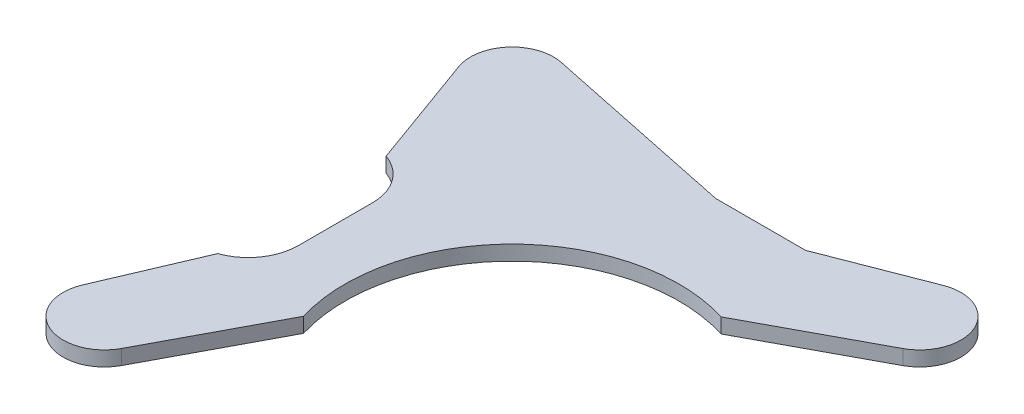
ISO-10303-21;
HEADER;
FILE_DESCRIPTION(('STEP AP214'),'2;1');
FILE_NAME('part.step','',(''),(''),'','','');
FILE_SCHEMA(('AUTOMOTIVE_DESIGN { 1 0 10303 214 1 1 1 1 }'));
ENDSEC;
DATA;
#1=APPLICATION_CONTEXT('core data for automotive mechanical design processes');
#2=APPLICATION_PROTOCOL_DEFINITION('international standard','automotive_design',2000,#1);
#3=PRODUCT_CONTEXT('',#1,'mechanical');
#4=PRODUCT('Part','Part','',(#3));
#5=PRODUCT_RELATED_PRODUCT_CATEGORY('part','',(#4));
#6=PRODUCT_DEFINITION_FORMATION('','',#4);
#7=PRODUCT_DEFINITION_CONTEXT('part definition',#1,'design');
#8=PRODUCT_DEFINITION('design','',#6,#7);
#9=PRODUCT_DEFINITION_SHAPE('','',#8);
#10=(LENGTH_UNIT() NAMED_UNIT(*) SI_UNIT(.MILLI.,.METRE.));
#11=(NAMED_UNIT(*) PLANE_ANGLE_UNIT() SI_UNIT($,.RADIAN.));
#12=(NAMED_UNIT(*) SI_UNIT($,.STERADIAN.) SOLID_ANGLE_UNIT());
#13=UNCERTAINTY_MEASURE_WITH_UNIT(LENGTH_MEASURE(1.E-05),#10,'distance_accuracy_value','');
#14=(GEOMETRIC_REPRESENTATION_CONTEXT(3) GLOBAL_UNCERTAINTY_ASSIGNED_CONTEXT((#13)) GLOBAL_UNIT_ASSIGNED_CONTEXT((#10,
#11,#12)) REPRESENTATION_CONTEXT('',''));
#15=CARTESIAN_POINT('',(0.,0.,0.));
#16=DIRECTION('',(0.,0.,1.));
#17=DIRECTION('',(1.,0.,0.));
#18=AXIS2_PLACEMENT_3D('',#15,#16,#17);
#19=CARTESIAN_POINT('',(-113.562518198404,153.3525,-81.0665633924503));
#20=DIRECTION('',(0.,-1.,0.));
#21=DIRECTION('',(0.,0.,-1.));
#22=AXIS2_PLACEMENT_3D('',#19,#20,#21);
#23=CYLINDRICAL_SURFACE('',#22,8.5725);
#24=CARTESIAN_POINT('',(-113.562518198404,150.8125,-81.0665633924503));
#25=DIRECTION('',(0.,1.,0.));
#26=DIRECTION('',(0.,0.,1.));
#27=AXIS2_PLACEMENT_3D('',#24,#25,#26);
#28=CIRCLE('',#27,8.5725);
#29=CARTESIAN_POINT('',(-104.990018198404,150.8125,-81.0665633924503));
#30=VERTEX_POINT('',#29);
#31=CARTESIAN_POINT('',(-110.73974168524,150.8125,-89.160986720071));
#32=VERTEX_POINT('',#31);
#33=EDGE_CURVE('E170',#30,#32,#28,.T.);
#34=ORIENTED_EDGE('',*,*,#33,.F.);
#35=DIRECTION('',(0.,-1.,0.));
#36=VECTOR('',#35,1.);
#37=CARTESIAN_POINT('',(-104.990018198404,153.3525,-81.0665633924503));
#38=LINE('',#37,#36);
#39=CARTESIAN_POINT('',(-104.990018198404,153.3525,-81.0665633924503));
#40=VERTEX_POINT('',#39);
#41=EDGE_CURVE('E11',#40,#30,#38,.T.);
#42=ORIENTED_EDGE('',*,*,#41,.F.);
#43=CARTESIAN_POINT('',(-113.562518198404,153.3525,-81.0665633924503));
#44=DIRECTION('',(0.,1.,0.));
#45=DIRECTION('',(0.,0.,1.));
#46=AXIS2_PLACEMENT_3D('',#43,#44,#45);
#47=CIRCLE('',#46,8.5725);
#48=CARTESIAN_POINT('',(-110.73974168524,153.3525,-89.160986720071));
#49=VERTEX_POINT('',#48);
#50=EDGE_CURVE('E205',#40,#49,#47,.T.);
#51=ORIENTED_EDGE('',*,*,#50,.T.);
#52=DIRECTION('',(0.,-1.,0.));
#53=VECTOR('',#52,1.);
#54=CARTESIAN_POINT('',(-110.73974168524,153.3525,-89.160986720071));
#55=LINE('',#54,#53);
#56=EDGE_CURVE('E55',#49,#32,#55,.T.);
#57=ORIENTED_EDGE('',*,*,#56,.T.);
#58=EDGE_LOOP('',(#34,#42,#51,#57));
#59=FACE_BOUND('',#58,.T.);
#60=ADVANCED_FACE('F39',(#59),#23,.F.);
#61=CARTESIAN_POINT('',(-104.990018198404,153.3525,4.58906832912148E-13));
#62=DIRECTION('',(1.,0.,0.));
#63=DIRECTION('',(0.,0.,-1.));
#64=AXIS2_PLACEMENT_3D('',#61,#62,#63);
#65=PLANE('',#64);
#66=DIRECTION('',(0.,0.,1.));
#67=VECTOR('',#66,1.);
#68=CARTESIAN_POINT('',(-104.990018198404,150.8125,4.58906832912148E-13));
#69=LINE('',#68,#67);
#70=CARTESIAN_POINT('',(-104.990018198404,150.8125,-68.3665633924507));
#71=VERTEX_POINT('',#70);
#72=EDGE_CURVE('E172',#30,#71,#69,.T.);
#73=ORIENTED_EDGE('',*,*,#72,.T.);
#74=DIRECTION('',(0.,-1.,0.));
#75=VECTOR('',#74,1.);
#76=CARTESIAN_POINT('',(-104.990018198404,153.3525,-68.3665633924507));
#77=LINE('',#76,#75);
#78=CARTESIAN_POINT('',(-104.990018198404,153.3525,-68.3665633924507));
#79=VERTEX_POINT('',#78);
#80=EDGE_CURVE('E47',#79,#71,#77,.T.);
#81=ORIENTED_EDGE('',*,*,#80,.F.);
#82=DIRECTION('',(0.,0.,1.));
#83=VECTOR('',#82,1.);
#84=CARTESIAN_POINT('',(-104.990018198404,153.3525,4.58906832912148E-13));
#85=LINE('',#84,#83);
#86=EDGE_CURVE('E418',#40,#79,#85,.T.);
#87=ORIENTED_EDGE('',*,*,#86,.F.);
#88=ORIENTED_EDGE('',*,*,#41,.T.);
#89=EDGE_LOOP('',(#73,#81,#87,#88));
#90=FACE_BOUND('',#89,.T.);
#91=ADVANCED_FACE('F235',(#90),#65,.F.);
#92=CARTESIAN_POINT('',(-113.562518198404,153.3525,-68.3665633924507));
#93=DIRECTION('',(0.,-1.,0.));
#94=DIRECTION('',(0.,0.,-1.));
#95=AXIS2_PLACEMENT_3D('',#92,#93,#94);
#96=CYLINDRICAL_SURFACE('',#95,8.57250000000006);
#97=CARTESIAN_POINT('',(-113.562518198404,150.8125,-68.3665633924507));
#98=DIRECTION('',(0.,1.,0.));
#99=DIRECTION('',(0.,0.,1.));
#100=AXIS2_PLACEMENT_3D('',#97,#98,#99);
#101=CIRCLE('',#100,8.57250000000006);
#102=CARTESIAN_POINT('',(-110.711477128956,150.8125,-60.2820522093105));
#103=VERTEX_POINT('',#102);
#104=EDGE_CURVE('E175',#103,#71,#101,.T.);
#105=ORIENTED_EDGE('',*,*,#104,.F.);
#106=DIRECTION('',(0.,-1.,0.));
#107=VECTOR('',#106,1.);
#108=CARTESIAN_POINT('',(-110.711477128956,153.3525,-60.2820522093105));
#109=LINE('',#108,#107);
#110=CARTESIAN_POINT('',(-110.711477128956,153.3525,-60.2820522093105));
#111=VERTEX_POINT('',#110);
#112=EDGE_CURVE('E225',#111,#103,#109,.T.);
#113=ORIENTED_EDGE('',*,*,#112,.F.);
#114=CARTESIAN_POINT('',(-113.562518198404,153.3525,-68.3665633924507));
#115=DIRECTION('',(0.,1.,0.));
#116=DIRECTION('',(0.,0.,1.));
#117=AXIS2_PLACEMENT_3D('',#114,#115,#116);
#118=CIRCLE('',#117,8.57250000000006);
#119=EDGE_CURVE('E232',#111,#79,#118,.T.);
#120=ORIENTED_EDGE('',*,*,#119,.T.);
#121=ORIENTED_EDGE('',*,*,#80,.T.);
#122=EDGE_LOOP('',(#105,#113,#120,#121));
#123=FACE_BOUND('',#122,.T.);
#124=ADVANCED_FACE('F230',(#123),#96,.F.);
#125=CARTESIAN_POINT('',(-115.433025578802,153.3525,-49.2056223935562));
#126=DIRECTION('',(0.919909867015772,0.,0.392129872066671));
#127=DIRECTION('',(0.392129872066671,0.,-0.919909867015772));
#128=AXIS2_PLACEMENT_3D('',#125,#126,#127);
#129=PLANE('',#128);
#130=DIRECTION('',(-0.392129872066671,0.,0.919909867015772));
#131=VECTOR('',#130,1.);
#132=CARTESIAN_POINT('',(-115.433025578802,150.8125,-49.2056223935562));
#133=LINE('',#132,#131);
#134=CARTESIAN_POINT('',(-117.631365352139,150.8125,-44.0484676022443));
#135=VERTEX_POINT('',#134);
#136=EDGE_CURVE('E178',#103,#135,#133,.T.);
#137=ORIENTED_EDGE('',*,*,#136,.T.);
#138=DIRECTION('',(0.,-1.,0.));
#139=VECTOR('',#138,1.);
#140=CARTESIAN_POINT('',(-117.631365352139,153.3525,-44.0484676022443));
#141=LINE('',#140,#139);
#142=CARTESIAN_POINT('',(-117.631365352139,153.3525,-44.0484676022443));
#143=VERTEX_POINT('',#142);
#144=EDGE_CURVE('E222',#143,#135,#141,.T.);
#145=ORIENTED_EDGE('',*,*,#144,.F.);
#146=DIRECTION('',(-0.392129872066671,0.,0.919909867015772));
#147=VECTOR('',#146,1.);
#148=CARTESIAN_POINT('',(-115.433025578802,153.3525,-49.2056223935562));
#149=LINE('',#148,#147);
#150=EDGE_CURVE('E252',#111,#143,#149,.T.);
#151=ORIENTED_EDGE('',*,*,#150,.F.);
#152=ORIENTED_EDGE('',*,*,#112,.T.);
#153=EDGE_LOOP('',(#137,#145,#151,#152));
#154=FACE_BOUND('',#153,.T.);
#155=ADVANCED_FACE('F242',(#154),#129,.F.);
#156=CARTESIAN_POINT('',(-111.125,153.3525,-41.275));
#157=DIRECTION('',(0.,-1.,0.));
#158=DIRECTION('',(0.,0.,-1.));
#159=AXIS2_PLACEMENT_3D('',#156,#157,#158);
#160=CYLINDRICAL_SURFACE('',#159,7.07282918189104);
#161=CARTESIAN_POINT('',(-111.125,150.8125,-41.275));
#162=DIRECTION('',(0.,1.,0.));
#163=DIRECTION('',(0.,0.,1.));
#164=AXIS2_PLACEMENT_3D('',#161,#162,#163);
#165=CIRCLE('',#164,7.07282918189104);
#166=CARTESIAN_POINT('',(-104.877861406879,150.8125,-37.9586507972547));
#167=VERTEX_POINT('',#166);
#168=EDGE_CURVE('E180',#135,#167,#165,.T.);
#169=ORIENTED_EDGE('',*,*,#168,.T.);
#170=DIRECTION('',(0.,-1.,0.));
#171=VECTOR('',#170,1.);
#172=CARTESIAN_POINT('',(-104.877861406879,153.3525,-37.9586507972547));
#173=LINE('',#172,#171);
#174=CARTESIAN_POINT('',(-104.877861406879,153.3525,-37.9586507972547));
#175=VERTEX_POINT('',#174);
#176=EDGE_CURVE('E220',#175,#167,#173,.T.);
#177=ORIENTED_EDGE('',*,*,#176,.F.);
#178=CARTESIAN_POINT('',(-111.125,153.3525,-41.275));
#179=DIRECTION('',(0.,1.,0.));
#180=DIRECTION('',(0.,0.,1.));
#181=AXIS2_PLACEMENT_3D('',#178,#179,#180);
#182=CIRCLE('',#181,7.07282918189104);
#183=EDGE_CURVE('E248',#143,#175,#182,.T.);
#184=ORIENTED_EDGE('',*,*,#183,.F.);
#185=ORIENTED_EDGE('',*,*,#144,.T.);
#186=EDGE_LOOP('',(#169,#177,#184,#185));
#187=FACE_BOUND('',#186,.T.);
#188=ADVANCED_FACE('F246',(#187),#160,.T.);
#189=CARTESIAN_POINT('',(-97.5405355507425,153.3525,-51.7802626734196));
#190=DIRECTION('',(0.883258796793192,0.,0.468885804740816));
#191=DIRECTION('',(0.468885804740816,0.,-0.883258796793192));
#192=AXIS2_PLACEMENT_3D('',#189,#190,#191);
#193=PLANE('',#192);
#194=DIRECTION('',(-0.468885804740816,0.,0.883258796793192));
#195=VECTOR('',#194,1.);
#196=CARTESIAN_POINT('',(-97.5405355507425,150.8125,-51.7802626734196));
#197=LINE('',#196,#195);
#198=CARTESIAN_POINT('',(-94.0562495805783,150.8125,-58.3437504194217));
#199=VERTEX_POINT('',#198);
#200=EDGE_CURVE('E183',#199,#167,#197,.T.);
#201=ORIENTED_EDGE('',*,*,#200,.F.);
#202=DIRECTION('',(0.,-1.,0.));
#203=VECTOR('',#202,1.);
#204=CARTESIAN_POINT('',(-94.0562495805783,153.3525,-58.3437504194217));
#205=LINE('',#204,#203);
#206=CARTESIAN_POINT('',(-94.0562495805783,153.3525,-58.3437504194217));
#207=VERTEX_POINT('',#206);
#208=EDGE_CURVE('E218',#207,#199,#205,.T.);
#209=ORIENTED_EDGE('',*,*,#208,.F.);
#210=DIRECTION('',(-0.468885804740816,0.,0.883258796793192));
#211=VECTOR('',#210,1.);
#212=CARTESIAN_POINT('',(-97.5405355507425,153.3525,-51.7802626734196));
#213=LINE('',#212,#211);
#214=EDGE_CURVE('E251',#207,#175,#213,.T.);
#215=ORIENTED_EDGE('',*,*,#214,.T.);
#216=ORIENTED_EDGE('',*,*,#176,.T.);
#217=EDGE_LOOP('',(#201,#209,#215,#216));
#218=FACE_BOUND('',#217,.T.);
#219=ADVANCED_FACE('F370',(#218),#193,.T.);
#220=CARTESIAN_POINT('',(-66.675,153.3525,-66.675));
#221=DIRECTION('',(0.,-1.,0.));
#222=DIRECTION('',(0.,0.,-1.));
#223=AXIS2_PLACEMENT_3D('',#220,#221,#222);
#224=CYLINDRICAL_SURFACE('',#223,28.620666452195);
#225=CARTESIAN_POINT('',(-66.675,150.8125,-66.675));
#226=DIRECTION('',(0.,1.,0.));
#227=DIRECTION('',(0.,0.,1.));
#228=AXIS2_PLACEMENT_3D('',#225,#226,#227);
#229=CIRCLE('',#228,28.620666452195);
#230=CARTESIAN_POINT('',(-58.204292246255,150.8125,-94.0134282342355));
#231=VERTEX_POINT('',#230);
#232=EDGE_CURVE('E186',#231,#199,#229,.T.);
#233=ORIENTED_EDGE('',*,*,#232,.F.);
#234=DIRECTION('',(0.,-1.,0.));
#235=VECTOR('',#234,1.);
#236=CARTESIAN_POINT('',(-58.204292246255,153.3525,-94.0134282342355));
#237=LINE('',#236,#235);
#238=CARTESIAN_POINT('',(-58.204292246255,153.3525,-94.0134282342355));
#239=VERTEX_POINT('',#238);
#240=EDGE_CURVE('E216',#239,#231,#237,.T.);
#241=ORIENTED_EDGE('',*,*,#240,.F.);
#242=CARTESIAN_POINT('',(-66.675,153.3525,-66.675));
#243=DIRECTION('',(0.,1.,0.));
#244=DIRECTION('',(0.,0.,1.));
#245=AXIS2_PLACEMENT_3D('',#242,#243,#244);
#246=CIRCLE('',#245,28.620666452195);
#247=EDGE_CURVE('E254',#239,#207,#246,.T.);
#248=ORIENTED_EDGE('',*,*,#247,.T.);
#249=ORIENTED_EDGE('',*,*,#208,.T.);
#250=EDGE_LOOP('',(#233,#241,#248,#249));
#251=FACE_BOUND('',#250,.T.);
#252=ADVANCED_FACE('F378',(#251),#224,.F.);
#253=CARTESIAN_POINT('',(-52.1838223807388,153.3525,-97.2441732706133));
#254=DIRECTION('',(-0.472846001893237,0.,-0.881145083680083));
#255=DIRECTION('',(-0.881145083680083,0.,0.472846001893237));
#256=AXIS2_PLACEMENT_3D('',#253,#254,#255);
#257=PLANE('',#256);
#258=DIRECTION('',(0.881145083680083,0.,-0.472846001893237));
#259=VECTOR('',#258,1.);
#260=CARTESIAN_POINT('',(-52.1838223807388,150.8125,-97.2441732706133));
#261=LINE('',#260,#259);
#262=CARTESIAN_POINT('',(-37.9306409992561,150.8125,-104.892811338644));
#263=VERTEX_POINT('',#262);
#264=EDGE_CURVE('E189',#231,#263,#261,.T.);
#265=ORIENTED_EDGE('',*,*,#264,.T.);
#266=DIRECTION('',(0.,-1.,0.));
#267=VECTOR('',#266,1.);
#268=CARTESIAN_POINT('',(-37.9306409992561,153.3525,-104.892811338644));
#269=LINE('',#268,#267);
#270=CARTESIAN_POINT('',(-37.9306409992561,153.3525,-104.892811338644));
#271=VERTEX_POINT('',#270);
#272=EDGE_CURVE('E213',#271,#263,#269,.T.);
#273=ORIENTED_EDGE('',*,*,#272,.F.);
#274=DIRECTION('',(0.881145083680083,0.,-0.472846001893237));
#275=VECTOR('',#274,1.);
#276=CARTESIAN_POINT('',(-52.1838223807388,153.3525,-97.2441732706133));
#277=LINE('',#276,#275);
#278=EDGE_CURVE('E261',#239,#271,#277,.T.);
#279=ORIENTED_EDGE('',*,*,#278,.F.);
#280=ORIENTED_EDGE('',*,*,#240,.T.);
#281=EDGE_LOOP('',(#265,#273,#279,#280));
#282=FACE_BOUND('',#281,.T.);
#283=ADVANCED_FACE('F387',(#282),#257,.F.);
#284=CARTESIAN_POINT('',(-41.275,153.3525,-111.125));
#285=DIRECTION('',(0.,-1.,0.));
#286=DIRECTION('',(0.,0.,-1.));
#287=AXIS2_PLACEMENT_3D('',#284,#285,#286);
#288=CYLINDRICAL_SURFACE('',#287,7.07282918191839);
#289=CARTESIAN_POINT('',(-41.275,150.8125,-111.125));
#290=DIRECTION('',(0.,1.,0.));
#291=DIRECTION('',(0.,0.,1.));
#292=AXIS2_PLACEMENT_3D('',#289,#290,#291);
#293=CIRCLE('',#292,7.07282918191839);
#294=CARTESIAN_POINT('',(-43.832903241686,150.8125,-117.719091570699));
#295=VERTEX_POINT('',#294);
#296=EDGE_CURVE('E191',#263,#295,#293,.T.);
#297=ORIENTED_EDGE('',*,*,#296,.T.);
#298=DIRECTION('',(0.,-1.,0.));
#299=VECTOR('',#298,1.);
#300=CARTESIAN_POINT('',(-43.832903241686,153.3525,-117.719091570699));
#301=LINE('',#300,#299);
#302=CARTESIAN_POINT('',(-43.832903241686,153.3525,-117.719091570699));
#303=VERTEX_POINT('',#302);
#304=EDGE_CURVE('E211',#303,#295,#301,.T.);
#305=ORIENTED_EDGE('',*,*,#304,.F.);
#306=CARTESIAN_POINT('',(-41.275,153.3525,-111.125));
#307=DIRECTION('',(0.,1.,0.));
#308=DIRECTION('',(0.,0.,1.));
#309=AXIS2_PLACEMENT_3D('',#306,#307,#308);
#310=CIRCLE('',#309,7.07282918191839);
#311=EDGE_CURVE('E263',#271,#303,#310,.T.);
#312=ORIENTED_EDGE('',*,*,#311,.F.);
#313=ORIENTED_EDGE('',*,*,#272,.T.);
#314=EDGE_LOOP('',(#297,#305,#312,#313));
#315=FACE_BOUND('',#314,.T.);
#316=ADVANCED_FACE('F276',(#315),#288,.T.);
#317=CARTESIAN_POINT('',(-45.4246977334963,153.3525,-117.101621181178));
#318=DIRECTION('',(-0.361652059719639,0.,-0.932313138221565));
#319=DIRECTION('',(-0.932313138221565,0.,0.361652059719639));
#320=AXIS2_PLACEMENT_3D('',#317,#318,#319);
#321=PLANE('',#320);
#322=DIRECTION('',(0.932313138221565,0.,-0.361652059719639));
#323=VECTOR('',#322,1.);
#324=CARTESIAN_POINT('',(-45.4246977334963,150.8125,-117.101621181178));
#325=LINE('',#324,#323);
#326=CARTESIAN_POINT('',(-60.8319995851853,150.8125,-111.125));
#327=VERTEX_POINT('',#326);
#328=EDGE_CURVE('E194',#327,#295,#325,.T.);
#329=ORIENTED_EDGE('',*,*,#328,.F.);
#330=DIRECTION('',(0.,-1.,0.));
#331=VECTOR('',#330,1.);
#332=CARTESIAN_POINT('',(-60.8319995851853,153.3525,-111.125));
#333=LINE('',#332,#331);
#334=CARTESIAN_POINT('',(-60.8319995851853,153.3525,-111.125));
#335=VERTEX_POINT('',#334);
#336=EDGE_CURVE('E209',#335,#327,#333,.T.);
#337=ORIENTED_EDGE('',*,*,#336,.F.);
#338=DIRECTION('',(0.932313138221565,0.,-0.361652059719639));
#339=VECTOR('',#338,1.);
#340=CARTESIAN_POINT('',(-45.4246977334963,153.3525,-117.101621181178));
#341=LINE('',#340,#339);
#342=EDGE_CURVE('E265',#335,#303,#341,.T.);
#343=ORIENTED_EDGE('',*,*,#342,.T.);
#344=ORIENTED_EDGE('',*,*,#304,.T.);
#345=EDGE_LOOP('',(#329,#337,#343,#344));
#346=FACE_BOUND('',#345,.T.);
#347=ADVANCED_FACE('F269',(#346),#321,.T.);
#348=CARTESIAN_POINT('',(0.,153.3525,-111.125));
#349=DIRECTION('',(0.,0.,1.));
#350=DIRECTION('',(1.,0.,0.));
#351=AXIS2_PLACEMENT_3D('',#348,#349,#350);
#352=PLANE('',#351);
#353=DIRECTION('',(-1.,0.,0.));
#354=VECTOR('',#353,1.);
#355=CARTESIAN_POINT('',(0.,150.8125,-111.125));
#356=LINE('',#355,#354);
#357=CARTESIAN_POINT('',(-76.2,150.8125,-111.125));
#358=VERTEX_POINT('',#357);
#359=EDGE_CURVE('E197',#327,#358,#356,.T.);
#360=ORIENTED_EDGE('',*,*,#359,.T.);
#361=DIRECTION('',(0.,-1.,0.));
#362=VECTOR('',#361,1.);
#363=CARTESIAN_POINT('',(-76.2,153.3525,-111.125));
#364=LINE('',#363,#362);
#365=CARTESIAN_POINT('',(-76.2,153.3525,-111.125));
#366=VERTEX_POINT('',#365);
#367=EDGE_CURVE('E162',#366,#358,#364,.T.);
#368=ORIENTED_EDGE('',*,*,#367,.F.);
#369=DIRECTION('',(-1.,0.,0.));
#370=VECTOR('',#369,1.);
#371=CARTESIAN_POINT('',(0.,153.3525,-111.125));
#372=LINE('',#371,#370);
#373=EDGE_CURVE('E150',#335,#366,#372,.T.);
#374=ORIENTED_EDGE('',*,*,#373,.F.);
#375=ORIENTED_EDGE('',*,*,#336,.T.);
#376=EDGE_LOOP('',(#360,#368,#374,#375));
#377=FACE_BOUND('',#376,.T.);
#378=ADVANCED_FACE('F281',(#377),#352,.F.);
#379=CARTESIAN_POINT('',(18.9950903919091,153.3525,-91.3249392259495));
#380=DIRECTION('',(-0.203636363636364,0.,0.979046593071524));
#381=DIRECTION('',(0.979046593071524,0.,0.203636363636364));
#382=AXIS2_PLACEMENT_3D('',#379,#380,#381);
#383=PLANE('',#382);
#384=DIRECTION('',(-0.979046593071524,0.,-0.203636363636364));
#385=VECTOR('',#384,1.);
#386=CARTESIAN_POINT('',(18.9950903919091,150.8125,-91.3249392259495));
#387=LINE('',#386,#385);
#388=CARTESIAN_POINT('',(-109.676738181818,150.8125,-118.087979369925));
#389=VERTEX_POINT('',#388);
#390=EDGE_CURVE('E159',#358,#389,#387,.T.);
#391=ORIENTED_EDGE('',*,*,#390,.T.);
#392=DIRECTION('',(0.,-1.,0.));
#393=VECTOR('',#392,1.);
#394=CARTESIAN_POINT('',(-109.676738181818,153.3525,-118.087979369925));
#395=LINE('',#394,#393);
#396=CARTESIAN_POINT('',(-109.676738181818,153.3525,-118.087979369925));
#397=VERTEX_POINT('',#396);
#398=EDGE_CURVE('E156',#397,#389,#395,.T.);
#399=ORIENTED_EDGE('',*,*,#398,.F.);
#400=DIRECTION('',(-0.979046593071524,0.,-0.203636363636364));
#401=VECTOR('',#400,1.);
#402=CARTESIAN_POINT('',(18.9950903919091,153.3525,-91.3249392259495));
#403=LINE('',#402,#401);
#404=EDGE_CURVE('E141',#366,#397,#403,.T.);
#405=ORIENTED_EDGE('',*,*,#404,.F.);
#406=ORIENTED_EDGE('',*,*,#367,.T.);
#407=EDGE_LOOP('',(#391,#399,#405,#406));
#408=FACE_BOUND('',#407,.T.);
#409=ADVANCED_FACE('F157',(#408),#383,.F.);
#410=CARTESIAN_POINT('',(-111.125,153.3525,-111.125));
#411=DIRECTION('',(0.,-1.,0.));
#412=DIRECTION('',(0.,0.,-1.));
#413=AXIS2_PLACEMENT_3D('',#410,#411,#412);
#414=CYLINDRICAL_SURFACE('',#413,7.112);
#415=CARTESIAN_POINT('',(-111.125,150.8125,-111.125));
#416=DIRECTION('',(0.,1.,0.));
#417=DIRECTION('',(0.,0.,1.));
#418=AXIS2_PLACEMENT_3D('',#415,#416,#417);
#419=CIRCLE('',#418,7.112);
#420=CARTESIAN_POINT('',(-117.812544275955,150.8125,-108.704814974606));
#421=VERTEX_POINT('',#420);
#422=EDGE_CURVE('E200',#389,#421,#419,.T.);
#423=ORIENTED_EDGE('',*,*,#422,.T.);
#424=DIRECTION('',(0.,-1.,0.));
#425=VECTOR('',#424,1.);
#426=CARTESIAN_POINT('',(-117.812544275955,153.3525,-108.704814974606));
#427=LINE('',#426,#425);
#428=CARTESIAN_POINT('',(-117.812544275955,153.3525,-108.704814974606));
#429=VERTEX_POINT('',#428);
#430=EDGE_CURVE('E99',#429,#421,#427,.T.);
#431=ORIENTED_EDGE('',*,*,#430,.F.);
#432=CARTESIAN_POINT('',(-111.125,153.3525,-111.125));
#433=DIRECTION('',(0.,1.,0.));
#434=DIRECTION('',(0.,0.,1.));
#435=AXIS2_PLACEMENT_3D('',#432,#433,#434);
#436=CIRCLE('',#435,7.112);
#437=EDGE_CURVE('E147',#397,#429,#436,.T.);
#438=ORIENTED_EDGE('',*,*,#437,.F.);
#439=ORIENTED_EDGE('',*,*,#398,.T.);
#440=EDGE_LOOP('',(#423,#431,#438,#439));
#441=FACE_BOUND('',#440,.T.);
#442=ADVANCED_FACE('F164',(#441),#414,.T.);
#443=CARTESIAN_POINT('',(-69.3856116478566,153.3525,25.1102663935575));
#444=DIRECTION('',(-0.940318374009426,0.,0.340295982198247));
#445=DIRECTION('',(0.340295982198247,0.,0.940318374009426));
#446=AXIS2_PLACEMENT_3D('',#443,#444,#445);
#447=PLANE('',#446);
#448=DIRECTION('',(-0.340295982198247,0.,-0.940318374009426));
#449=VECTOR('',#448,1.);
#450=CARTESIAN_POINT('',(-69.3856116478566,150.8125,25.1102663935575));
#451=LINE('',#450,#449);
#452=EDGE_CURVE('E202',#32,#421,#451,.T.);
#453=ORIENTED_EDGE('',*,*,#452,.F.);
#454=ORIENTED_EDGE('',*,*,#56,.F.);
#455=DIRECTION('',(-0.340295982198247,0.,-0.940318374009426));
#456=VECTOR('',#455,1.);
#457=CARTESIAN_POINT('',(-69.3856116478566,153.3525,25.1102663935575));
#458=LINE('',#457,#456);
#459=EDGE_CURVE('E165',#49,#429,#458,.T.);
#460=ORIENTED_EDGE('',*,*,#459,.T.);
#461=ORIENTED_EDGE('',*,*,#430,.T.);
#462=EDGE_LOOP('',(#453,#454,#460,#461));
#463=FACE_BOUND('',#462,.T.);
#464=ADVANCED_FACE('F296',(#463),#447,.T.);
#465=CARTESIAN_POINT('',(0.,153.3525,0.));
#466=DIRECTION('',(0.,1.,0.));
#467=DIRECTION('',(0.,0.,1.));
#468=AXIS2_PLACEMENT_3D('',#465,#466,#467);
#469=PLANE('',#468);
#470=ORIENTED_EDGE('',*,*,#50,.F.);
#471=ORIENTED_EDGE('',*,*,#86,.T.);
#472=ORIENTED_EDGE('',*,*,#119,.F.);
#473=ORIENTED_EDGE('',*,*,#150,.T.);
#474=ORIENTED_EDGE('',*,*,#183,.T.);
#475=ORIENTED_EDGE('',*,*,#214,.F.);
#476=ORIENTED_EDGE('',*,*,#247,.F.);
#477=ORIENTED_EDGE('',*,*,#278,.T.);
#478=ORIENTED_EDGE('',*,*,#311,.T.);
#479=ORIENTED_EDGE('',*,*,#342,.F.);
#480=ORIENTED_EDGE('',*,*,#373,.T.);
#481=ORIENTED_EDGE('',*,*,#404,.T.);
#482=ORIENTED_EDGE('',*,*,#437,.T.);
#483=ORIENTED_EDGE('',*,*,#459,.F.);
#484=EDGE_LOOP('',(#470,#471,#472,#473,#474,#475,#476,#477,#478,#479,#480,#481,#482,#483));
#485=FACE_BOUND('',#484,.T.);
#486=ADVANCED_FACE('F144',(#485),#469,.T.);
#487=CARTESIAN_POINT('',(0.,150.8125,0.));
#488=DIRECTION('',(0.,1.,0.));
#489=DIRECTION('',(0.,0.,1.));
#490=AXIS2_PLACEMENT_3D('',#487,#488,#489);
#491=PLANE('',#490);
#492=ORIENTED_EDGE('',*,*,#33,.T.);
#493=ORIENTED_EDGE('',*,*,#452,.T.);
#494=ORIENTED_EDGE('',*,*,#422,.F.);
#495=ORIENTED_EDGE('',*,*,#390,.F.);
#496=ORIENTED_EDGE('',*,*,#359,.F.);
#497=ORIENTED_EDGE('',*,*,#328,.T.);
#498=ORIENTED_EDGE('',*,*,#296,.F.);
#499=ORIENTED_EDGE('',*,*,#264,.F.);
#500=ORIENTED_EDGE('',*,*,#232,.T.);
#501=ORIENTED_EDGE('',*,*,#200,.T.);
#502=ORIENTED_EDGE('',*,*,#168,.F.);
#503=ORIENTED_EDGE('',*,*,#136,.F.);
#504=ORIENTED_EDGE('',*,*,#104,.T.);
#505=ORIENTED_EDGE('',*,*,#72,.F.);
#506=EDGE_LOOP('',(#492,#493,#494,#495,#496,#497,#498,#499,#500,#501,#502,#503,#504,#505));
#507=FACE_BOUND('',#506,.T.);
#508=ADVANCED_FACE('F238',(#507),#491,.F.);
#509=CLOSED_SHELL('',(#60,#91,#124,#155,#188,#219,#252,#283,#316,#347,#378,#409,#442,#464,#486,#508));
#510=MANIFOLD_SOLID_BREP('B2',#509);
#511=ADVANCED_BREP_SHAPE_REPRESENTATION('',(#18,#510),#14);
#512=SHAPE_DEFINITION_REPRESENTATION(#9,#511);
ENDSEC;
END-ISO-10303-21;
